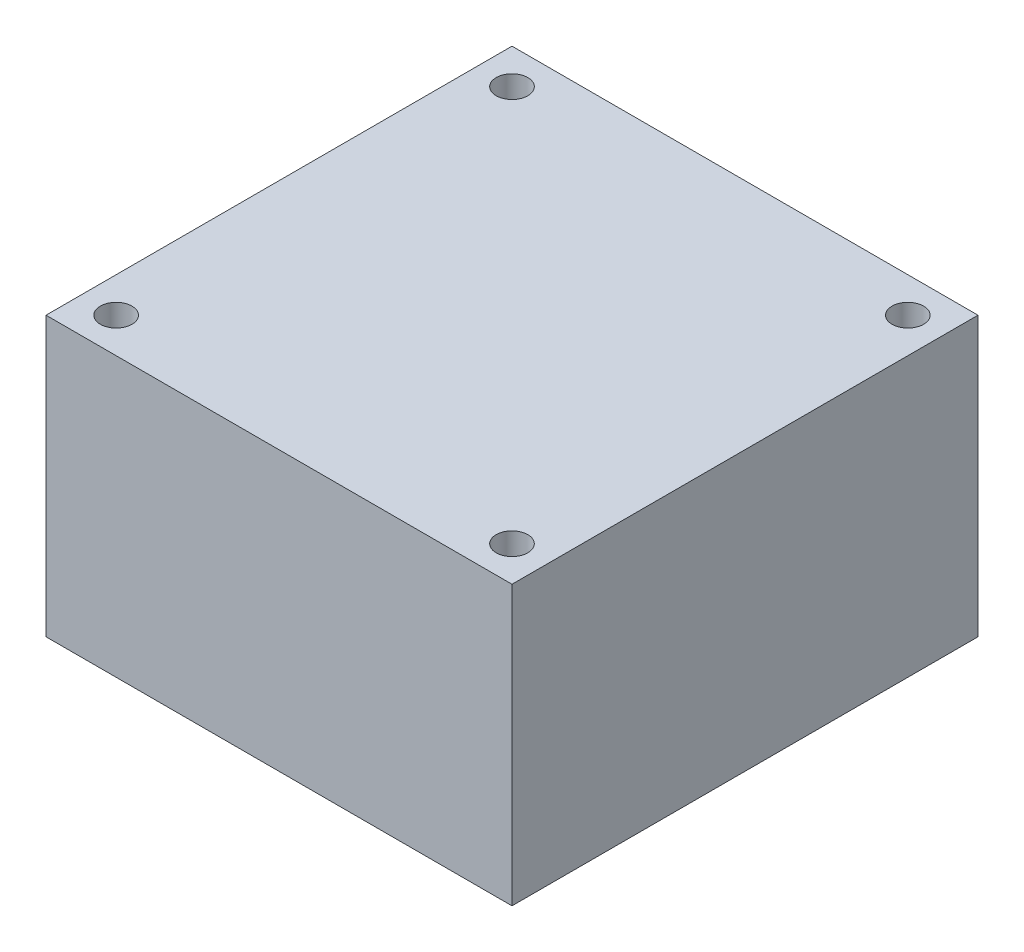
ISO-10303-21;
HEADER;
FILE_DESCRIPTION(('STEP AP214'),'2;1');
FILE_NAME('part.step','',(''),(''),'','','');
FILE_SCHEMA(('AUTOMOTIVE_DESIGN { 1 0 10303 214 1 1 1 1 }'));
ENDSEC;
DATA;
#1=APPLICATION_CONTEXT('core data for automotive mechanical design processes');
#2=APPLICATION_PROTOCOL_DEFINITION('international standard','automotive_design',2000,#1);
#3=PRODUCT_CONTEXT('',#1,'mechanical');
#4=PRODUCT('Part','Part','',(#3));
#5=PRODUCT_RELATED_PRODUCT_CATEGORY('part','',(#4));
#6=PRODUCT_DEFINITION_FORMATION('','',#4);
#7=PRODUCT_DEFINITION_CONTEXT('part definition',#1,'design');
#8=PRODUCT_DEFINITION('design','',#6,#7);
#9=PRODUCT_DEFINITION_SHAPE('','',#8);
#10=(LENGTH_UNIT() NAMED_UNIT(*) SI_UNIT(.MILLI.,.METRE.));
#11=(NAMED_UNIT(*) PLANE_ANGLE_UNIT() SI_UNIT($,.RADIAN.));
#12=(NAMED_UNIT(*) SI_UNIT($,.STERADIAN.) SOLID_ANGLE_UNIT());
#13=UNCERTAINTY_MEASURE_WITH_UNIT(LENGTH_MEASURE(1.E-05),#10,'distance_accuracy_value','');
#14=(GEOMETRIC_REPRESENTATION_CONTEXT(3) GLOBAL_UNCERTAINTY_ASSIGNED_CONTEXT((#13)) GLOBAL_UNIT_ASSIGNED_CONTEXT((#10,
#11,#12)) REPRESENTATION_CONTEXT('',''));
#15=CARTESIAN_POINT('',(0.,0.,0.));
#16=DIRECTION('',(0.,0.,1.));
#17=DIRECTION('',(1.,0.,0.));
#18=AXIS2_PLACEMENT_3D('',#15,#16,#17);
#19=CARTESIAN_POINT('',(21.75,26.,-21.75));
#20=DIRECTION('',(-1.,0.,0.));
#21=DIRECTION('',(0.,0.,1.));
#22=AXIS2_PLACEMENT_3D('',#19,#20,#21);
#23=PLANE('',#22);
#24=DIRECTION('',(0.,0.,-1.));
#25=VECTOR('',#24,1.);
#26=CARTESIAN_POINT('',(21.75,0.,-21.75));
#27=LINE('',#26,#25);
#28=CARTESIAN_POINT('',(21.75,0.,21.75));
#29=VERTEX_POINT('',#28);
#30=CARTESIAN_POINT('',(21.75,0.,-21.75));
#31=VERTEX_POINT('',#30);
#32=EDGE_CURVE('E96',#29,#31,#27,.T.);
#33=ORIENTED_EDGE('',*,*,#32,.T.);
#34=DIRECTION('',(0.,-1.,0.));
#35=VECTOR('',#34,1.);
#36=CARTESIAN_POINT('',(21.75,26.,-21.75));
#37=LINE('',#36,#35);
#38=CARTESIAN_POINT('',(21.75,26.,-21.75));
#39=VERTEX_POINT('',#38);
#40=EDGE_CURVE('E11',#39,#31,#37,.T.);
#41=ORIENTED_EDGE('',*,*,#40,.F.);
#42=DIRECTION('',(0.,0.,-1.));
#43=VECTOR('',#42,1.);
#44=CARTESIAN_POINT('',(21.75,26.,-21.75));
#45=LINE('',#44,#43);
#46=CARTESIAN_POINT('',(21.75,26.,21.75));
#47=VERTEX_POINT('',#46);
#48=EDGE_CURVE('E84',#47,#39,#45,.T.);
#49=ORIENTED_EDGE('',*,*,#48,.F.);
#50=DIRECTION('',(0.,-1.,0.));
#51=VECTOR('',#50,1.);
#52=CARTESIAN_POINT('',(21.75,26.,21.75));
#53=LINE('',#52,#51);
#54=EDGE_CURVE('E92',#47,#29,#53,.T.);
#55=ORIENTED_EDGE('',*,*,#54,.T.);
#56=EDGE_LOOP('',(#33,#41,#49,#55));
#57=FACE_BOUND('',#56,.T.);
#58=ADVANCED_FACE('F33',(#57),#23,.F.);
#59=CARTESIAN_POINT('',(-21.75,26.,-21.75));
#60=DIRECTION('',(0.,0.,1.));
#61=DIRECTION('',(1.,0.,0.));
#62=AXIS2_PLACEMENT_3D('',#59,#60,#61);
#63=PLANE('',#62);
#64=DIRECTION('',(-1.,0.,0.));
#65=VECTOR('',#64,1.);
#66=CARTESIAN_POINT('',(-21.75,0.,-21.75));
#67=LINE('',#66,#65);
#68=CARTESIAN_POINT('',(-21.75,0.,-21.75));
#69=VERTEX_POINT('',#68);
#70=EDGE_CURVE('E88',#31,#69,#67,.T.);
#71=ORIENTED_EDGE('',*,*,#70,.T.);
#72=DIRECTION('',(0.,-1.,0.));
#73=VECTOR('',#72,1.);
#74=CARTESIAN_POINT('',(-21.75,26.,-21.75));
#75=LINE('',#74,#73);
#76=CARTESIAN_POINT('',(-21.75,26.,-21.75));
#77=VERTEX_POINT('',#76);
#78=EDGE_CURVE('E41',#77,#69,#75,.T.);
#79=ORIENTED_EDGE('',*,*,#78,.F.);
#80=DIRECTION('',(-1.,0.,0.));
#81=VECTOR('',#80,1.);
#82=CARTESIAN_POINT('',(-21.75,26.,-21.75));
#83=LINE('',#82,#81);
#84=EDGE_CURVE('E79',#39,#77,#83,.T.);
#85=ORIENTED_EDGE('',*,*,#84,.F.);
#86=ORIENTED_EDGE('',*,*,#40,.T.);
#87=EDGE_LOOP('',(#71,#79,#85,#86));
#88=FACE_BOUND('',#87,.T.);
#89=ADVANCED_FACE('F87',(#88),#63,.F.);
#90=CARTESIAN_POINT('',(-21.75,26.,-21.75));
#91=DIRECTION('',(1.,0.,0.));
#92=DIRECTION('',(0.,0.,-1.));
#93=AXIS2_PLACEMENT_3D('',#90,#91,#92);
#94=PLANE('',#93);
#95=DIRECTION('',(0.,0.,1.));
#96=VECTOR('',#95,1.);
#97=CARTESIAN_POINT('',(-21.75,0.,-21.75));
#98=LINE('',#97,#96);
#99=CARTESIAN_POINT('',(-21.75,0.,21.75));
#100=VERTEX_POINT('',#99);
#101=EDGE_CURVE('E66',#69,#100,#98,.T.);
#102=ORIENTED_EDGE('',*,*,#101,.T.);
#103=DIRECTION('',(0.,-1.,0.));
#104=VECTOR('',#103,1.);
#105=CARTESIAN_POINT('',(-21.75,26.,21.75));
#106=LINE('',#105,#104);
#107=CARTESIAN_POINT('',(-21.75,26.,21.75));
#108=VERTEX_POINT('',#107);
#109=EDGE_CURVE('E89',#108,#100,#106,.T.);
#110=ORIENTED_EDGE('',*,*,#109,.F.);
#111=DIRECTION('',(0.,0.,1.));
#112=VECTOR('',#111,1.);
#113=CARTESIAN_POINT('',(-21.75,26.,-21.75));
#114=LINE('',#113,#112);
#115=EDGE_CURVE('E82',#77,#108,#114,.T.);
#116=ORIENTED_EDGE('',*,*,#115,.F.);
#117=ORIENTED_EDGE('',*,*,#78,.T.);
#118=EDGE_LOOP('',(#102,#110,#116,#117));
#119=FACE_BOUND('',#118,.T.);
#120=ADVANCED_FACE('F90',(#119),#94,.F.);
#121=CARTESIAN_POINT('',(-21.75,26.,21.75));
#122=DIRECTION('',(0.,0.,-1.));
#123=DIRECTION('',(-1.,0.,0.));
#124=AXIS2_PLACEMENT_3D('',#121,#122,#123);
#125=PLANE('',#124);
#126=DIRECTION('',(1.,0.,0.));
#127=VECTOR('',#126,1.);
#128=CARTESIAN_POINT('',(-21.75,0.,21.75));
#129=LINE('',#128,#127);
#130=EDGE_CURVE('E72',#100,#29,#129,.T.);
#131=ORIENTED_EDGE('',*,*,#130,.T.);
#132=ORIENTED_EDGE('',*,*,#54,.F.);
#133=DIRECTION('',(1.,0.,0.));
#134=VECTOR('',#133,1.);
#135=CARTESIAN_POINT('',(-21.75,26.,21.75));
#136=LINE('',#135,#134);
#137=EDGE_CURVE('E49',#108,#47,#136,.T.);
#138=ORIENTED_EDGE('',*,*,#137,.F.);
#139=ORIENTED_EDGE('',*,*,#109,.T.);
#140=EDGE_LOOP('',(#131,#132,#138,#139));
#141=FACE_BOUND('',#140,.T.);
#142=ADVANCED_FACE('F104',(#141),#125,.F.);
#143=CARTESIAN_POINT('',(0.,26.,0.));
#144=DIRECTION('',(0.,1.,0.));
#145=DIRECTION('',(0.,0.,1.));
#146=AXIS2_PLACEMENT_3D('',#143,#144,#145);
#147=PLANE('',#146);
#148=CARTESIAN_POINT('',(-18.475,26.,18.475));
#149=DIRECTION('',(0.,1.,0.));
#150=DIRECTION('',(0.,0.,1.));
#151=AXIS2_PLACEMENT_3D('',#148,#149,#150);
#152=CIRCLE('',#151,1.475);
#153=CARTESIAN_POINT('',(-18.475,26.,19.95));
#154=VERTEX_POINT('',#153);
#155=EDGE_CURVE('E128',#154,#154,#152,.T.);
#156=ORIENTED_EDGE('',*,*,#155,.F.);
#157=EDGE_LOOP('',(#156));
#158=FACE_BOUND('',#157,.T.);
#159=CARTESIAN_POINT('',(18.475,26.,18.475));
#160=DIRECTION('',(0.,1.,0.));
#161=DIRECTION('',(0.,0.,1.));
#162=AXIS2_PLACEMENT_3D('',#159,#160,#161);
#163=CIRCLE('',#162,1.475);
#164=CARTESIAN_POINT('',(18.475,26.,19.95));
#165=VERTEX_POINT('',#164);
#166=EDGE_CURVE('E122',#165,#165,#163,.T.);
#167=ORIENTED_EDGE('',*,*,#166,.F.);
#168=EDGE_LOOP('',(#167));
#169=FACE_BOUND('',#168,.T.);
#170=CARTESIAN_POINT('',(18.475,26.,-18.475));
#171=DIRECTION('',(0.,1.,0.));
#172=DIRECTION('',(0.,0.,1.));
#173=AXIS2_PLACEMENT_3D('',#170,#171,#172);
#174=CIRCLE('',#173,1.475);
#175=CARTESIAN_POINT('',(18.475,26.,-17.));
#176=VERTEX_POINT('',#175);
#177=EDGE_CURVE('E116',#176,#176,#174,.T.);
#178=ORIENTED_EDGE('',*,*,#177,.F.);
#179=EDGE_LOOP('',(#178));
#180=FACE_BOUND('',#179,.T.);
#181=CARTESIAN_POINT('',(-18.475,26.,-18.475));
#182=DIRECTION('',(0.,1.,0.));
#183=DIRECTION('',(0.,0.,1.));
#184=AXIS2_PLACEMENT_3D('',#181,#182,#183);
#185=CIRCLE('',#184,1.475);
#186=CARTESIAN_POINT('',(-18.475,26.,-17.));
#187=VERTEX_POINT('',#186);
#188=EDGE_CURVE('E110',#187,#187,#185,.T.);
#189=ORIENTED_EDGE('',*,*,#188,.F.);
#190=EDGE_LOOP('',(#189));
#191=FACE_BOUND('',#190,.T.);
#192=ORIENTED_EDGE('',*,*,#48,.T.);
#193=ORIENTED_EDGE('',*,*,#84,.T.);
#194=ORIENTED_EDGE('',*,*,#115,.T.);
#195=ORIENTED_EDGE('',*,*,#137,.T.);
#196=EDGE_LOOP('',(#192,#193,#194,#195));
#197=FACE_BOUND('',#196,.T.);
#198=ADVANCED_FACE('F80',(#158,#169,#180,#191,#197),#147,.T.);
#199=CARTESIAN_POINT('',(0.,0.,0.));
#200=DIRECTION('',(0.,1.,0.));
#201=DIRECTION('',(0.,0.,1.));
#202=AXIS2_PLACEMENT_3D('',#199,#200,#201);
#203=PLANE('',#202);
#204=CARTESIAN_POINT('',(-18.475,0.,18.475));
#205=DIRECTION('',(0.,1.,0.));
#206=DIRECTION('',(0.,0.,1.));
#207=AXIS2_PLACEMENT_3D('',#204,#205,#206);
#208=CIRCLE('',#207,1.475);
#209=CARTESIAN_POINT('',(-18.475,0.,19.95));
#210=VERTEX_POINT('',#209);
#211=EDGE_CURVE('E113',#210,#210,#208,.T.);
#212=ORIENTED_EDGE('',*,*,#211,.T.);
#213=EDGE_LOOP('',(#212));
#214=FACE_BOUND('',#213,.T.);
#215=CARTESIAN_POINT('',(18.475,0.,18.475));
#216=DIRECTION('',(0.,1.,0.));
#217=DIRECTION('',(0.,0.,1.));
#218=AXIS2_PLACEMENT_3D('',#215,#216,#217);
#219=CIRCLE('',#218,1.475);
#220=CARTESIAN_POINT('',(18.475,0.,19.95));
#221=VERTEX_POINT('',#220);
#222=EDGE_CURVE('E125',#221,#221,#219,.T.);
#223=ORIENTED_EDGE('',*,*,#222,.T.);
#224=EDGE_LOOP('',(#223));
#225=FACE_BOUND('',#224,.T.);
#226=CARTESIAN_POINT('',(18.475,0.,-18.475));
#227=DIRECTION('',(0.,1.,0.));
#228=DIRECTION('',(0.,0.,1.));
#229=AXIS2_PLACEMENT_3D('',#226,#227,#228);
#230=CIRCLE('',#229,1.475);
#231=CARTESIAN_POINT('',(18.475,0.,-17.));
#232=VERTEX_POINT('',#231);
#233=EDGE_CURVE('E119',#232,#232,#230,.T.);
#234=ORIENTED_EDGE('',*,*,#233,.T.);
#235=EDGE_LOOP('',(#234));
#236=FACE_BOUND('',#235,.T.);
#237=CARTESIAN_POINT('',(-18.475,0.,-18.475));
#238=DIRECTION('',(0.,1.,0.));
#239=DIRECTION('',(0.,0.,1.));
#240=AXIS2_PLACEMENT_3D('',#237,#238,#239);
#241=CIRCLE('',#240,1.475);
#242=CARTESIAN_POINT('',(-18.475,0.,-17.));
#243=VERTEX_POINT('',#242);
#244=EDGE_CURVE('E99',#243,#243,#241,.T.);
#245=ORIENTED_EDGE('',*,*,#244,.T.);
#246=EDGE_LOOP('',(#245));
#247=FACE_BOUND('',#246,.T.);
#248=ORIENTED_EDGE('',*,*,#32,.F.);
#249=ORIENTED_EDGE('',*,*,#130,.F.);
#250=ORIENTED_EDGE('',*,*,#101,.F.);
#251=ORIENTED_EDGE('',*,*,#70,.F.);
#252=EDGE_LOOP('',(#248,#249,#250,#251));
#253=FACE_BOUND('',#252,.T.);
#254=ADVANCED_FACE('F107',(#214,#225,#236,#247,#253),#203,.F.);
#255=CARTESIAN_POINT('',(-18.475,0.,-18.475));
#256=DIRECTION('',(0.,1.,0.));
#257=DIRECTION('',(0.,0.,1.));
#258=AXIS2_PLACEMENT_3D('',#255,#256,#257);
#259=CYLINDRICAL_SURFACE('',#258,1.475);
#260=CARTESIAN_POINT('',(-18.475,0.,-17.));
#261=CARTESIAN_POINT('',(-18.475,0.270833333333333,-17.));
#262=CARTESIAN_POINT('',(-18.475,0.541666666666667,-17.));
#263=CARTESIAN_POINT('',(-18.475,1.08333333333333,-17.));
#264=CARTESIAN_POINT('',(-18.475,1.35416666666667,-17.));
#265=CARTESIAN_POINT('',(-18.475,1.89583333333333,-17.));
#266=CARTESIAN_POINT('',(-18.475,2.16666666666667,-17.));
#267=CARTESIAN_POINT('',(-18.475,2.70833333333333,-17.));
#268=CARTESIAN_POINT('',(-18.475,2.97916666666667,-17.));
#269=CARTESIAN_POINT('',(-18.475,3.52083333333333,-17.));
#270=CARTESIAN_POINT('',(-18.475,3.79166666666667,-17.));
#271=CARTESIAN_POINT('',(-18.475,4.33333333333333,-17.));
#272=CARTESIAN_POINT('',(-18.475,4.60416666666667,-17.));
#273=CARTESIAN_POINT('',(-18.475,5.14583333333333,-17.));
#274=CARTESIAN_POINT('',(-18.475,5.41666666666667,-17.));
#275=CARTESIAN_POINT('',(-18.475,5.95833333333333,-17.));
#276=CARTESIAN_POINT('',(-18.475,6.22916666666667,-17.));
#277=CARTESIAN_POINT('',(-18.475,6.77083333333333,-17.));
#278=CARTESIAN_POINT('',(-18.475,7.04166666666667,-17.));
#279=CARTESIAN_POINT('',(-18.475,7.58333333333333,-17.));
#280=CARTESIAN_POINT('',(-18.475,7.85416666666667,-17.));
#281=CARTESIAN_POINT('',(-18.475,8.39583333333333,-17.));
#282=CARTESIAN_POINT('',(-18.475,8.66666666666667,-17.));
#283=CARTESIAN_POINT('',(-18.475,9.20833333333333,-17.));
#284=CARTESIAN_POINT('',(-18.475,9.47916666666667,-17.));
#285=CARTESIAN_POINT('',(-18.475,10.0208333333333,-17.));
#286=CARTESIAN_POINT('',(-18.475,10.2916666666667,-17.));
#287=CARTESIAN_POINT('',(-18.475,10.8333333333333,-17.));
#288=CARTESIAN_POINT('',(-18.475,11.1041666666667,-17.));
#289=CARTESIAN_POINT('',(-18.475,11.6458333333333,-17.));
#290=CARTESIAN_POINT('',(-18.475,11.9166666666667,-17.));
#291=CARTESIAN_POINT('',(-18.475,12.4583333333333,-17.));
#292=CARTESIAN_POINT('',(-18.475,12.7291666666667,-17.));
#293=CARTESIAN_POINT('',(-18.475,13.2708333333333,-17.));
#294=CARTESIAN_POINT('',(-18.475,13.5416666666667,-17.));
#295=CARTESIAN_POINT('',(-18.475,14.0833333333333,-17.));
#296=CARTESIAN_POINT('',(-18.475,14.3541666666667,-17.));
#297=CARTESIAN_POINT('',(-18.475,14.8958333333333,-17.));
#298=CARTESIAN_POINT('',(-18.475,15.1666666666667,-17.));
#299=CARTESIAN_POINT('',(-18.475,15.7083333333333,-17.));
#300=CARTESIAN_POINT('',(-18.475,15.9791666666667,-17.));
#301=CARTESIAN_POINT('',(-18.475,16.5208333333333,-17.));
#302=CARTESIAN_POINT('',(-18.475,16.7916666666667,-17.));
#303=CARTESIAN_POINT('',(-18.475,17.3333333333333,-17.));
#304=CARTESIAN_POINT('',(-18.475,17.6041666666667,-17.));
#305=CARTESIAN_POINT('',(-18.475,18.1458333333333,-17.));
#306=CARTESIAN_POINT('',(-18.475,18.4166666666667,-17.));
#307=CARTESIAN_POINT('',(-18.475,18.9583333333333,-17.));
#308=CARTESIAN_POINT('',(-18.475,19.2291666666667,-17.));
#309=CARTESIAN_POINT('',(-18.475,19.7708333333333,-17.));
#310=CARTESIAN_POINT('',(-18.475,20.0416666666667,-17.));
#311=CARTESIAN_POINT('',(-18.475,20.5833333333333,-17.));
#312=CARTESIAN_POINT('',(-18.475,20.8541666666667,-17.));
#313=CARTESIAN_POINT('',(-18.475,21.3958333333333,-17.));
#314=CARTESIAN_POINT('',(-18.475,21.6666666666667,-17.));
#315=CARTESIAN_POINT('',(-18.475,22.2083333333333,-17.));
#316=CARTESIAN_POINT('',(-18.475,22.4791666666667,-17.));
#317=CARTESIAN_POINT('',(-18.475,23.0208333333333,-17.));
#318=CARTESIAN_POINT('',(-18.475,23.2916666666667,-17.));
#319=CARTESIAN_POINT('',(-18.475,23.8333333333333,-17.));
#320=CARTESIAN_POINT('',(-18.475,24.1041666666667,-17.));
#321=CARTESIAN_POINT('',(-18.475,24.6458333333333,-17.));
#322=CARTESIAN_POINT('',(-18.475,24.9166666666667,-17.));
#323=CARTESIAN_POINT('',(-18.475,25.4583333333333,-17.));
#324=CARTESIAN_POINT('',(-18.475,25.7291666666667,-17.));
#325=CARTESIAN_POINT('',(-18.475,26.,-17.));
#326=B_SPLINE_CURVE_WITH_KNOTS('',3,(#260,#261,#262,#263,#264,#265,#266,#267,#268,#269,#270,
#271,#272,#273,#274,#275,#276,#277,#278,#279,#280,#281,#282,#283,#284,#285,#286,#287,#288,#289,
#290,#291,#292,#293,#294,#295,#296,#297,#298,#299,#300,#301,#302,#303,#304,#305,#306,#307,#308,
#309,#310,#311,#312,#313,#314,#315,#316,#317,#318,#319,#320,#321,#322,#323,#324,#325),
.UNSPECIFIED.,.F.,.F.,(4,2,2,2,2,2,2,2,2,2,2,2,2,2,2,2,2,2,2,2,2,2,2,2,2,2,2,2,2,2,2,2,4),(0.,
0.8125,1.625,2.4375,3.25,4.0625,4.875,5.6875,6.5,7.3125,8.125,8.9375,9.75,10.5625,11.375,
12.1875,13.,13.8125,14.625,15.4375,16.25,17.0625,17.875,18.6875,19.5,20.3125,21.125,21.9375,
22.75,23.5625,24.375,25.1875,26.),.UNSPECIFIED.);
#327=EDGE_CURVE('BSEAM152',#243,#187,#326,.T.);
#328=ORIENTED_EDGE('',*,*,#244,.F.);
#329=ORIENTED_EDGE('',*,*,#188,.T.);
#330=ORIENTED_EDGE('',*,*,#327,.T.);
#331=ORIENTED_EDGE('',*,*,#327,.F.);
#332=EDGE_LOOP('',(#328,#330,#329,#331));
#333=FACE_BOUND('',#332,.T.);
#334=ADVANCED_FACE('F152',(#333),#259,.F.);
#335=CARTESIAN_POINT('',(18.475,0.,-18.475));
#336=DIRECTION('',(0.,1.,0.));
#337=DIRECTION('',(0.,0.,1.));
#338=AXIS2_PLACEMENT_3D('',#335,#336,#337);
#339=CYLINDRICAL_SURFACE('',#338,1.475);
#340=CARTESIAN_POINT('',(18.475,0.,-17.));
#341=CARTESIAN_POINT('',(18.475,0.270833333333333,-17.));
#342=CARTESIAN_POINT('',(18.475,0.541666666666667,-17.));
#343=CARTESIAN_POINT('',(18.475,1.08333333333333,-17.));
#344=CARTESIAN_POINT('',(18.475,1.35416666666667,-17.));
#345=CARTESIAN_POINT('',(18.475,1.89583333333333,-17.));
#346=CARTESIAN_POINT('',(18.475,2.16666666666667,-17.));
#347=CARTESIAN_POINT('',(18.475,2.70833333333333,-17.));
#348=CARTESIAN_POINT('',(18.475,2.97916666666667,-17.));
#349=CARTESIAN_POINT('',(18.475,3.52083333333333,-17.));
#350=CARTESIAN_POINT('',(18.475,3.79166666666667,-17.));
#351=CARTESIAN_POINT('',(18.475,4.33333333333333,-17.));
#352=CARTESIAN_POINT('',(18.475,4.60416666666667,-17.));
#353=CARTESIAN_POINT('',(18.475,5.14583333333333,-17.));
#354=CARTESIAN_POINT('',(18.475,5.41666666666667,-17.));
#355=CARTESIAN_POINT('',(18.475,5.95833333333333,-17.));
#356=CARTESIAN_POINT('',(18.475,6.22916666666667,-17.));
#357=CARTESIAN_POINT('',(18.475,6.77083333333333,-17.));
#358=CARTESIAN_POINT('',(18.475,7.04166666666667,-17.));
#359=CARTESIAN_POINT('',(18.475,7.58333333333333,-17.));
#360=CARTESIAN_POINT('',(18.475,7.85416666666667,-17.));
#361=CARTESIAN_POINT('',(18.475,8.39583333333333,-17.));
#362=CARTESIAN_POINT('',(18.475,8.66666666666667,-17.));
#363=CARTESIAN_POINT('',(18.475,9.20833333333333,-17.));
#364=CARTESIAN_POINT('',(18.475,9.47916666666667,-17.));
#365=CARTESIAN_POINT('',(18.475,10.0208333333333,-17.));
#366=CARTESIAN_POINT('',(18.475,10.2916666666667,-17.));
#367=CARTESIAN_POINT('',(18.475,10.8333333333333,-17.));
#368=CARTESIAN_POINT('',(18.475,11.1041666666667,-17.));
#369=CARTESIAN_POINT('',(18.475,11.6458333333333,-17.));
#370=CARTESIAN_POINT('',(18.475,11.9166666666667,-17.));
#371=CARTESIAN_POINT('',(18.475,12.4583333333333,-17.));
#372=CARTESIAN_POINT('',(18.475,12.7291666666667,-17.));
#373=CARTESIAN_POINT('',(18.475,13.2708333333333,-17.));
#374=CARTESIAN_POINT('',(18.475,13.5416666666667,-17.));
#375=CARTESIAN_POINT('',(18.475,14.0833333333333,-17.));
#376=CARTESIAN_POINT('',(18.475,14.3541666666667,-17.));
#377=CARTESIAN_POINT('',(18.475,14.8958333333333,-17.));
#378=CARTESIAN_POINT('',(18.475,15.1666666666667,-17.));
#379=CARTESIAN_POINT('',(18.475,15.7083333333333,-17.));
#380=CARTESIAN_POINT('',(18.475,15.9791666666667,-17.));
#381=CARTESIAN_POINT('',(18.475,16.5208333333333,-17.));
#382=CARTESIAN_POINT('',(18.475,16.7916666666667,-17.));
#383=CARTESIAN_POINT('',(18.475,17.3333333333333,-17.));
#384=CARTESIAN_POINT('',(18.475,17.6041666666667,-17.));
#385=CARTESIAN_POINT('',(18.475,18.1458333333333,-17.));
#386=CARTESIAN_POINT('',(18.475,18.4166666666667,-17.));
#387=CARTESIAN_POINT('',(18.475,18.9583333333333,-17.));
#388=CARTESIAN_POINT('',(18.475,19.2291666666667,-17.));
#389=CARTESIAN_POINT('',(18.475,19.7708333333333,-17.));
#390=CARTESIAN_POINT('',(18.475,20.0416666666667,-17.));
#391=CARTESIAN_POINT('',(18.475,20.5833333333333,-17.));
#392=CARTESIAN_POINT('',(18.475,20.8541666666667,-17.));
#393=CARTESIAN_POINT('',(18.475,21.3958333333333,-17.));
#394=CARTESIAN_POINT('',(18.475,21.6666666666667,-17.));
#395=CARTESIAN_POINT('',(18.475,22.2083333333333,-17.));
#396=CARTESIAN_POINT('',(18.475,22.4791666666667,-17.));
#397=CARTESIAN_POINT('',(18.475,23.0208333333333,-17.));
#398=CARTESIAN_POINT('',(18.475,23.2916666666667,-17.));
#399=CARTESIAN_POINT('',(18.475,23.8333333333333,-17.));
#400=CARTESIAN_POINT('',(18.475,24.1041666666667,-17.));
#401=CARTESIAN_POINT('',(18.475,24.6458333333333,-17.));
#402=CARTESIAN_POINT('',(18.475,24.9166666666667,-17.));
#403=CARTESIAN_POINT('',(18.475,25.4583333333333,-17.));
#404=CARTESIAN_POINT('',(18.475,25.7291666666667,-17.));
#405=CARTESIAN_POINT('',(18.475,26.,-17.));
#406=B_SPLINE_CURVE_WITH_KNOTS('',3,(#340,#341,#342,#343,#344,#345,#346,#347,#348,#349,#350,
#351,#352,#353,#354,#355,#356,#357,#358,#359,#360,#361,#362,#363,#364,#365,#366,#367,#368,#369,
#370,#371,#372,#373,#374,#375,#376,#377,#378,#379,#380,#381,#382,#383,#384,#385,#386,#387,#388,
#389,#390,#391,#392,#393,#394,#395,#396,#397,#398,#399,#400,#401,#402,#403,#404,#405),
.UNSPECIFIED.,.F.,.F.,(4,2,2,2,2,2,2,2,2,2,2,2,2,2,2,2,2,2,2,2,2,2,2,2,2,2,2,2,2,2,2,2,4),(0.,
0.8125,1.625,2.4375,3.25,4.0625,4.875,5.6875,6.5,7.3125,8.125,8.9375,9.75,10.5625,11.375,
12.1875,13.,13.8125,14.625,15.4375,16.25,17.0625,17.875,18.6875,19.5,20.3125,21.125,21.9375,
22.75,23.5625,24.375,25.1875,26.),.UNSPECIFIED.);
#407=EDGE_CURVE('BSEAM154',#232,#176,#406,.T.);
#408=ORIENTED_EDGE('',*,*,#233,.F.);
#409=ORIENTED_EDGE('',*,*,#177,.T.);
#410=ORIENTED_EDGE('',*,*,#407,.T.);
#411=ORIENTED_EDGE('',*,*,#407,.F.);
#412=EDGE_LOOP('',(#408,#410,#409,#411));
#413=FACE_BOUND('',#412,.T.);
#414=ADVANCED_FACE('F154',(#413),#339,.F.);
#415=CARTESIAN_POINT('',(18.475,0.,18.475));
#416=DIRECTION('',(0.,1.,0.));
#417=DIRECTION('',(0.,0.,1.));
#418=AXIS2_PLACEMENT_3D('',#415,#416,#417);
#419=CYLINDRICAL_SURFACE('',#418,1.475);
#420=CARTESIAN_POINT('',(18.475,0.,19.95));
#421=CARTESIAN_POINT('',(18.475,0.270833333333333,19.95));
#422=CARTESIAN_POINT('',(18.475,0.541666666666667,19.95));
#423=CARTESIAN_POINT('',(18.475,1.08333333333333,19.95));
#424=CARTESIAN_POINT('',(18.475,1.35416666666667,19.95));
#425=CARTESIAN_POINT('',(18.475,1.89583333333333,19.95));
#426=CARTESIAN_POINT('',(18.475,2.16666666666667,19.95));
#427=CARTESIAN_POINT('',(18.475,2.70833333333333,19.95));
#428=CARTESIAN_POINT('',(18.475,2.97916666666667,19.95));
#429=CARTESIAN_POINT('',(18.475,3.52083333333333,19.95));
#430=CARTESIAN_POINT('',(18.475,3.79166666666667,19.95));
#431=CARTESIAN_POINT('',(18.475,4.33333333333333,19.95));
#432=CARTESIAN_POINT('',(18.475,4.60416666666667,19.95));
#433=CARTESIAN_POINT('',(18.475,5.14583333333333,19.95));
#434=CARTESIAN_POINT('',(18.475,5.41666666666667,19.95));
#435=CARTESIAN_POINT('',(18.475,5.95833333333333,19.95));
#436=CARTESIAN_POINT('',(18.475,6.22916666666667,19.95));
#437=CARTESIAN_POINT('',(18.475,6.77083333333333,19.95));
#438=CARTESIAN_POINT('',(18.475,7.04166666666667,19.95));
#439=CARTESIAN_POINT('',(18.475,7.58333333333333,19.95));
#440=CARTESIAN_POINT('',(18.475,7.85416666666667,19.95));
#441=CARTESIAN_POINT('',(18.475,8.39583333333333,19.95));
#442=CARTESIAN_POINT('',(18.475,8.66666666666667,19.95));
#443=CARTESIAN_POINT('',(18.475,9.20833333333333,19.95));
#444=CARTESIAN_POINT('',(18.475,9.47916666666667,19.95));
#445=CARTESIAN_POINT('',(18.475,10.0208333333333,19.95));
#446=CARTESIAN_POINT('',(18.475,10.2916666666667,19.95));
#447=CARTESIAN_POINT('',(18.475,10.8333333333333,19.95));
#448=CARTESIAN_POINT('',(18.475,11.1041666666667,19.95));
#449=CARTESIAN_POINT('',(18.475,11.6458333333333,19.95));
#450=CARTESIAN_POINT('',(18.475,11.9166666666667,19.95));
#451=CARTESIAN_POINT('',(18.475,12.4583333333333,19.95));
#452=CARTESIAN_POINT('',(18.475,12.7291666666667,19.95));
#453=CARTESIAN_POINT('',(18.475,13.2708333333333,19.95));
#454=CARTESIAN_POINT('',(18.475,13.5416666666667,19.95));
#455=CARTESIAN_POINT('',(18.475,14.0833333333333,19.95));
#456=CARTESIAN_POINT('',(18.475,14.3541666666667,19.95));
#457=CARTESIAN_POINT('',(18.475,14.8958333333333,19.95));
#458=CARTESIAN_POINT('',(18.475,15.1666666666667,19.95));
#459=CARTESIAN_POINT('',(18.475,15.7083333333333,19.95));
#460=CARTESIAN_POINT('',(18.475,15.9791666666667,19.95));
#461=CARTESIAN_POINT('',(18.475,16.5208333333333,19.95));
#462=CARTESIAN_POINT('',(18.475,16.7916666666667,19.95));
#463=CARTESIAN_POINT('',(18.475,17.3333333333333,19.95));
#464=CARTESIAN_POINT('',(18.475,17.6041666666667,19.95));
#465=CARTESIAN_POINT('',(18.475,18.1458333333333,19.95));
#466=CARTESIAN_POINT('',(18.475,18.4166666666667,19.95));
#467=CARTESIAN_POINT('',(18.475,18.9583333333333,19.95));
#468=CARTESIAN_POINT('',(18.475,19.2291666666667,19.95));
#469=CARTESIAN_POINT('',(18.475,19.7708333333333,19.95));
#470=CARTESIAN_POINT('',(18.475,20.0416666666667,19.95));
#471=CARTESIAN_POINT('',(18.475,20.5833333333333,19.95));
#472=CARTESIAN_POINT('',(18.475,20.8541666666667,19.95));
#473=CARTESIAN_POINT('',(18.475,21.3958333333333,19.95));
#474=CARTESIAN_POINT('',(18.475,21.6666666666667,19.95));
#475=CARTESIAN_POINT('',(18.475,22.2083333333333,19.95));
#476=CARTESIAN_POINT('',(18.475,22.4791666666667,19.95));
#477=CARTESIAN_POINT('',(18.475,23.0208333333333,19.95));
#478=CARTESIAN_POINT('',(18.475,23.2916666666667,19.95));
#479=CARTESIAN_POINT('',(18.475,23.8333333333333,19.95));
#480=CARTESIAN_POINT('',(18.475,24.1041666666667,19.95));
#481=CARTESIAN_POINT('',(18.475,24.6458333333333,19.95));
#482=CARTESIAN_POINT('',(18.475,24.9166666666667,19.95));
#483=CARTESIAN_POINT('',(18.475,25.4583333333333,19.95));
#484=CARTESIAN_POINT('',(18.475,25.7291666666667,19.95));
#485=CARTESIAN_POINT('',(18.475,26.,19.95));
#486=B_SPLINE_CURVE_WITH_KNOTS('',3,(#420,#421,#422,#423,#424,#425,#426,#427,#428,#429,#430,
#431,#432,#433,#434,#435,#436,#437,#438,#439,#440,#441,#442,#443,#444,#445,#446,#447,#448,#449,
#450,#451,#452,#453,#454,#455,#456,#457,#458,#459,#460,#461,#462,#463,#464,#465,#466,#467,#468,
#469,#470,#471,#472,#473,#474,#475,#476,#477,#478,#479,#480,#481,#482,#483,#484,#485),
.UNSPECIFIED.,.F.,.F.,(4,2,2,2,2,2,2,2,2,2,2,2,2,2,2,2,2,2,2,2,2,2,2,2,2,2,2,2,2,2,2,2,4),(0.,
0.8125,1.625,2.4375,3.25,4.0625,4.875,5.6875,6.5,7.3125,8.125,8.9375,9.75,10.5625,11.375,
12.1875,13.,13.8125,14.625,15.4375,16.25,17.0625,17.875,18.6875,19.5,20.3125,21.125,21.9375,
22.75,23.5625,24.375,25.1875,26.),.UNSPECIFIED.);
#487=EDGE_CURVE('BSEAM139',#221,#165,#486,.T.);
#488=ORIENTED_EDGE('',*,*,#222,.F.);
#489=ORIENTED_EDGE('',*,*,#166,.T.);
#490=ORIENTED_EDGE('',*,*,#487,.T.);
#491=ORIENTED_EDGE('',*,*,#487,.F.);
#492=EDGE_LOOP('',(#488,#490,#489,#491));
#493=FACE_BOUND('',#492,.T.);
#494=ADVANCED_FACE('F139',(#493),#419,.F.);
#495=CARTESIAN_POINT('',(-18.475,0.,18.475));
#496=DIRECTION('',(0.,1.,0.));
#497=DIRECTION('',(0.,0.,1.));
#498=AXIS2_PLACEMENT_3D('',#495,#496,#497);
#499=CYLINDRICAL_SURFACE('',#498,1.475);
#500=CARTESIAN_POINT('',(-18.475,0.,19.95));
#501=CARTESIAN_POINT('',(-18.475,0.270833333333333,19.95));
#502=CARTESIAN_POINT('',(-18.475,0.541666666666667,19.95));
#503=CARTESIAN_POINT('',(-18.475,1.08333333333333,19.95));
#504=CARTESIAN_POINT('',(-18.475,1.35416666666667,19.95));
#505=CARTESIAN_POINT('',(-18.475,1.89583333333333,19.95));
#506=CARTESIAN_POINT('',(-18.475,2.16666666666667,19.95));
#507=CARTESIAN_POINT('',(-18.475,2.70833333333333,19.95));
#508=CARTESIAN_POINT('',(-18.475,2.97916666666667,19.95));
#509=CARTESIAN_POINT('',(-18.475,3.52083333333333,19.95));
#510=CARTESIAN_POINT('',(-18.475,3.79166666666667,19.95));
#511=CARTESIAN_POINT('',(-18.475,4.33333333333333,19.95));
#512=CARTESIAN_POINT('',(-18.475,4.60416666666667,19.95));
#513=CARTESIAN_POINT('',(-18.475,5.14583333333333,19.95));
#514=CARTESIAN_POINT('',(-18.475,5.41666666666667,19.95));
#515=CARTESIAN_POINT('',(-18.475,5.95833333333333,19.95));
#516=CARTESIAN_POINT('',(-18.475,6.22916666666667,19.95));
#517=CARTESIAN_POINT('',(-18.475,6.77083333333333,19.95));
#518=CARTESIAN_POINT('',(-18.475,7.04166666666667,19.95));
#519=CARTESIAN_POINT('',(-18.475,7.58333333333333,19.95));
#520=CARTESIAN_POINT('',(-18.475,7.85416666666667,19.95));
#521=CARTESIAN_POINT('',(-18.475,8.39583333333333,19.95));
#522=CARTESIAN_POINT('',(-18.475,8.66666666666667,19.95));
#523=CARTESIAN_POINT('',(-18.475,9.20833333333333,19.95));
#524=CARTESIAN_POINT('',(-18.475,9.47916666666667,19.95));
#525=CARTESIAN_POINT('',(-18.475,10.0208333333333,19.95));
#526=CARTESIAN_POINT('',(-18.475,10.2916666666667,19.95));
#527=CARTESIAN_POINT('',(-18.475,10.8333333333333,19.95));
#528=CARTESIAN_POINT('',(-18.475,11.1041666666667,19.95));
#529=CARTESIAN_POINT('',(-18.475,11.6458333333333,19.95));
#530=CARTESIAN_POINT('',(-18.475,11.9166666666667,19.95));
#531=CARTESIAN_POINT('',(-18.475,12.4583333333333,19.95));
#532=CARTESIAN_POINT('',(-18.475,12.7291666666667,19.95));
#533=CARTESIAN_POINT('',(-18.475,13.2708333333333,19.95));
#534=CARTESIAN_POINT('',(-18.475,13.5416666666667,19.95));
#535=CARTESIAN_POINT('',(-18.475,14.0833333333333,19.95));
#536=CARTESIAN_POINT('',(-18.475,14.3541666666667,19.95));
#537=CARTESIAN_POINT('',(-18.475,14.8958333333333,19.95));
#538=CARTESIAN_POINT('',(-18.475,15.1666666666667,19.95));
#539=CARTESIAN_POINT('',(-18.475,15.7083333333333,19.95));
#540=CARTESIAN_POINT('',(-18.475,15.9791666666667,19.95));
#541=CARTESIAN_POINT('',(-18.475,16.5208333333333,19.95));
#542=CARTESIAN_POINT('',(-18.475,16.7916666666667,19.95));
#543=CARTESIAN_POINT('',(-18.475,17.3333333333333,19.95));
#544=CARTESIAN_POINT('',(-18.475,17.6041666666667,19.95));
#545=CARTESIAN_POINT('',(-18.475,18.1458333333333,19.95));
#546=CARTESIAN_POINT('',(-18.475,18.4166666666667,19.95));
#547=CARTESIAN_POINT('',(-18.475,18.9583333333333,19.95));
#548=CARTESIAN_POINT('',(-18.475,19.2291666666667,19.95));
#549=CARTESIAN_POINT('',(-18.475,19.7708333333333,19.95));
#550=CARTESIAN_POINT('',(-18.475,20.0416666666667,19.95));
#551=CARTESIAN_POINT('',(-18.475,20.5833333333333,19.95));
#552=CARTESIAN_POINT('',(-18.475,20.8541666666667,19.95));
#553=CARTESIAN_POINT('',(-18.475,21.3958333333333,19.95));
#554=CARTESIAN_POINT('',(-18.475,21.6666666666667,19.95));
#555=CARTESIAN_POINT('',(-18.475,22.2083333333333,19.95));
#556=CARTESIAN_POINT('',(-18.475,22.4791666666667,19.95));
#557=CARTESIAN_POINT('',(-18.475,23.0208333333333,19.95));
#558=CARTESIAN_POINT('',(-18.475,23.2916666666667,19.95));
#559=CARTESIAN_POINT('',(-18.475,23.8333333333333,19.95));
#560=CARTESIAN_POINT('',(-18.475,24.1041666666667,19.95));
#561=CARTESIAN_POINT('',(-18.475,24.6458333333333,19.95));
#562=CARTESIAN_POINT('',(-18.475,24.9166666666667,19.95));
#563=CARTESIAN_POINT('',(-18.475,25.4583333333333,19.95));
#564=CARTESIAN_POINT('',(-18.475,25.7291666666667,19.95));
#565=CARTESIAN_POINT('',(-18.475,26.,19.95));
#566=B_SPLINE_CURVE_WITH_KNOTS('',3,(#500,#501,#502,#503,#504,#505,#506,#507,#508,#509,#510,
#511,#512,#513,#514,#515,#516,#517,#518,#519,#520,#521,#522,#523,#524,#525,#526,#527,#528,#529,
#530,#531,#532,#533,#534,#535,#536,#537,#538,#539,#540,#541,#542,#543,#544,#545,#546,#547,#548,
#549,#550,#551,#552,#553,#554,#555,#556,#557,#558,#559,#560,#561,#562,#563,#564,#565),
.UNSPECIFIED.,.F.,.F.,(4,2,2,2,2,2,2,2,2,2,2,2,2,2,2,2,2,2,2,2,2,2,2,2,2,2,2,2,2,2,2,2,4),(0.,
0.8125,1.625,2.4375,3.25,4.0625,4.875,5.6875,6.5,7.3125,8.125,8.9375,9.75,10.5625,11.375,
12.1875,13.,13.8125,14.625,15.4375,16.25,17.0625,17.875,18.6875,19.5,20.3125,21.125,21.9375,
22.75,23.5625,24.375,25.1875,26.),.UNSPECIFIED.);
#567=EDGE_CURVE('BSEAM136',#210,#154,#566,.T.);
#568=ORIENTED_EDGE('',*,*,#211,.F.);
#569=ORIENTED_EDGE('',*,*,#155,.T.);
#570=ORIENTED_EDGE('',*,*,#567,.T.);
#571=ORIENTED_EDGE('',*,*,#567,.F.);
#572=EDGE_LOOP('',(#568,#570,#569,#571));
#573=FACE_BOUND('',#572,.T.);
#574=ADVANCED_FACE('F136',(#573),#499,.F.);
#575=CLOSED_SHELL('',(#58,#89,#120,#142,#198,#254,#334,#414,#494,#574));
#576=MANIFOLD_SOLID_BREP('B2',#575);
#577=ADVANCED_BREP_SHAPE_REPRESENTATION('',(#18,#576),#14);
#578=SHAPE_DEFINITION_REPRESENTATION(#9,#577);
ENDSEC;
END-ISO-10303-21;
